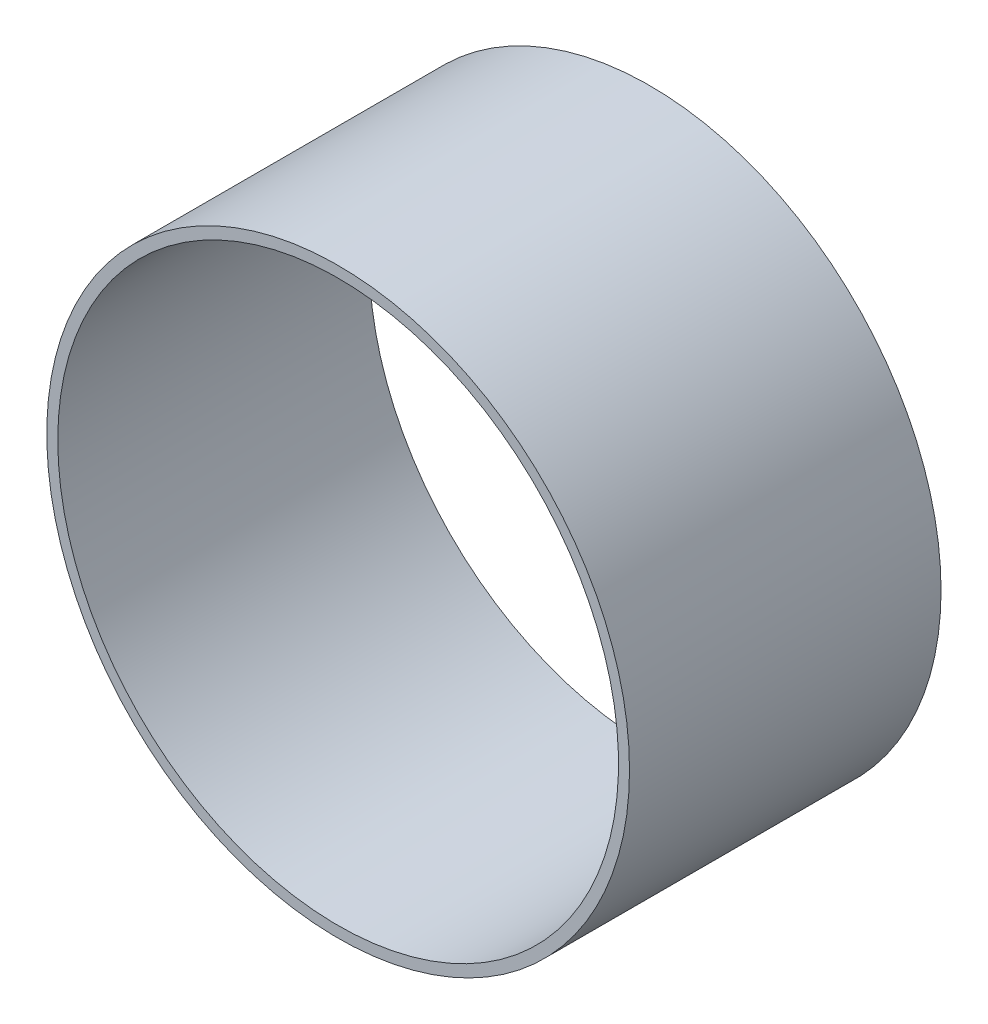
ISO-10303-21;
HEADER;
FILE_DESCRIPTION(('STEP AP214'),'2;1');
FILE_NAME('part.step','',(''),(''),'','','');
FILE_SCHEMA(('AUTOMOTIVE_DESIGN { 1 0 10303 214 1 1 1 1 }'));
ENDSEC;
DATA;
#1=APPLICATION_CONTEXT('core data for automotive mechanical design processes');
#2=APPLICATION_PROTOCOL_DEFINITION('international standard','automotive_design',2000,#1);
#3=PRODUCT_CONTEXT('',#1,'mechanical');
#4=PRODUCT('Part','Part','',(#3));
#5=PRODUCT_RELATED_PRODUCT_CATEGORY('part','',(#4));
#6=PRODUCT_DEFINITION_FORMATION('','',#4);
#7=PRODUCT_DEFINITION_CONTEXT('part definition',#1,'design');
#8=PRODUCT_DEFINITION('design','',#6,#7);
#9=PRODUCT_DEFINITION_SHAPE('','',#8);
#10=(LENGTH_UNIT() NAMED_UNIT(*) SI_UNIT(.MILLI.,.METRE.));
#11=(NAMED_UNIT(*) PLANE_ANGLE_UNIT() SI_UNIT($,.RADIAN.));
#12=(NAMED_UNIT(*) SI_UNIT($,.STERADIAN.) SOLID_ANGLE_UNIT());
#13=UNCERTAINTY_MEASURE_WITH_UNIT(LENGTH_MEASURE(1.E-05),#10,'distance_accuracy_value','');
#14=(GEOMETRIC_REPRESENTATION_CONTEXT(3) GLOBAL_UNCERTAINTY_ASSIGNED_CONTEXT((#13)) GLOBAL_UNIT_ASSIGNED_CONTEXT((#10,
#11,#12)) REPRESENTATION_CONTEXT('',''));
#15=CARTESIAN_POINT('',(0.,0.,0.));
#16=DIRECTION('',(0.,0.,1.));
#17=DIRECTION('',(1.,0.,0.));
#18=AXIS2_PLACEMENT_3D('',#15,#16,#17);
#19=CARTESIAN_POINT('',(0.,0.,-42.5));
#20=DIRECTION('',(0.,0.,-1.));
#21=DIRECTION('',(0.,-1.,0.));
#22=AXIS2_PLACEMENT_3D('',#19,#20,#21);
#23=PLANE('',#22);
#24=CARTESIAN_POINT('',(0.,0.,-42.5));
#25=DIRECTION('',(0.,0.,-1.));
#26=DIRECTION('',(-1.,0.,0.));
#27=AXIS2_PLACEMENT_3D('',#24,#25,#26);
#28=CIRCLE('',#27,76.5);
#29=CARTESIAN_POINT('',(-76.5,0.,-42.5));
#30=VERTEX_POINT('',#29);
#31=EDGE_CURVE('E11',#30,#30,#28,.T.);
#32=ORIENTED_EDGE('',*,*,#31,.F.);
#33=EDGE_LOOP('',(#32));
#34=FACE_BOUND('',#33,.T.);
#35=CARTESIAN_POINT('',(0.,0.,-42.5));
#36=DIRECTION('',(0.,0.,-1.));
#37=DIRECTION('',(1.,0.,0.));
#38=AXIS2_PLACEMENT_3D('',#35,#36,#37);
#39=CIRCLE('',#38,79.5);
#40=CARTESIAN_POINT('',(79.5,0.,-42.5));
#41=VERTEX_POINT('',#40);
#42=EDGE_CURVE('E20',#41,#41,#39,.T.);
#43=ORIENTED_EDGE('',*,*,#42,.T.);
#44=EDGE_LOOP('',(#43));
#45=FACE_BOUND('',#44,.T.);
#46=ADVANCED_FACE('F16',(#34,#45),#23,.T.);
#47=CARTESIAN_POINT('',(0.,0.,42.5));
#48=DIRECTION('',(0.,0.,1.));
#49=DIRECTION('',(-1.,0.,0.));
#50=AXIS2_PLACEMENT_3D('',#47,#48,#49);
#51=CYLINDRICAL_SURFACE('',#50,76.5);
#52=CARTESIAN_POINT('',(0.,0.,42.5));
#53=DIRECTION('',(0.,0.,-1.));
#54=DIRECTION('',(-1.,0.,0.));
#55=AXIS2_PLACEMENT_3D('',#52,#53,#54);
#56=CIRCLE('',#55,76.5);
#57=CARTESIAN_POINT('',(-76.5,0.,42.5));
#58=VERTEX_POINT('',#57);
#59=EDGE_CURVE('E26',#58,#58,#56,.T.);
#60=ORIENTED_EDGE('',*,*,#59,.F.);
#61=EDGE_LOOP('',(#60));
#62=FACE_BOUND('',#61,.T.);
#63=ORIENTED_EDGE('',*,*,#31,.T.);
#64=EDGE_LOOP('',(#63));
#65=FACE_BOUND('',#64,.T.);
#66=ADVANCED_FACE('F18',(#62,#65),#51,.F.);
#67=CARTESIAN_POINT('',(0.,0.,42.5));
#68=DIRECTION('',(0.,0.,-1.));
#69=DIRECTION('',(0.,-1.,0.));
#70=AXIS2_PLACEMENT_3D('',#67,#68,#69);
#71=PLANE('',#70);
#72=ORIENTED_EDGE('',*,*,#59,.T.);
#73=EDGE_LOOP('',(#72));
#74=FACE_BOUND('',#73,.T.);
#75=CARTESIAN_POINT('',(0.,0.,42.5));
#76=DIRECTION('',(0.,0.,-1.));
#77=DIRECTION('',(1.,0.,0.));
#78=AXIS2_PLACEMENT_3D('',#75,#76,#77);
#79=CIRCLE('',#78,79.5);
#80=CARTESIAN_POINT('',(79.5,0.,42.5));
#81=VERTEX_POINT('',#80);
#82=EDGE_CURVE('E54',#81,#81,#79,.T.);
#83=ORIENTED_EDGE('',*,*,#82,.F.);
#84=EDGE_LOOP('',(#83));
#85=FACE_BOUND('',#84,.T.);
#86=ADVANCED_FACE('F68',(#74,#85),#71,.F.);
#87=CARTESIAN_POINT('',(0.,0.,42.5));
#88=DIRECTION('',(0.,0.,1.));
#89=DIRECTION('',(-1.,0.,0.));
#90=AXIS2_PLACEMENT_3D('',#87,#88,#89);
#91=CYLINDRICAL_SURFACE('',#90,79.5);
#92=ORIENTED_EDGE('',*,*,#82,.T.);
#93=EDGE_LOOP('',(#92));
#94=FACE_BOUND('',#93,.T.);
#95=ORIENTED_EDGE('',*,*,#42,.F.);
#96=EDGE_LOOP('',(#95));
#97=FACE_BOUND('',#96,.T.);
#98=ADVANCED_FACE('F66',(#94,#97),#91,.T.);
#99=CLOSED_SHELL('',(#46,#66,#86,#98));
#100=MANIFOLD_SOLID_BREP('B1',#99);
#101=ADVANCED_BREP_SHAPE_REPRESENTATION('',(#18,#100),#14);
#102=SHAPE_DEFINITION_REPRESENTATION(#9,#101);
ENDSEC;
END-ISO-10303-21;
